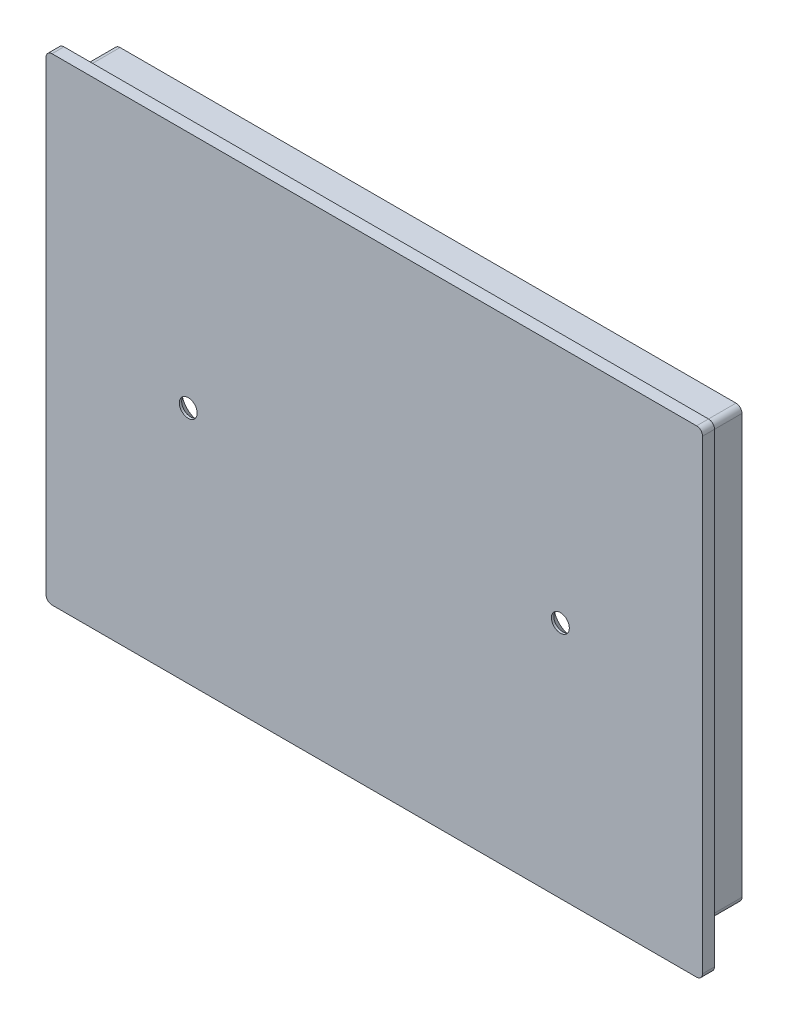
ISO-10303-21;
HEADER;
FILE_DESCRIPTION(('STEP AP214'),'2;1');
FILE_NAME('part.step','',(''),(''),'','','');
FILE_SCHEMA(('AUTOMOTIVE_DESIGN { 1 0 10303 214 1 1 1 1 }'));
ENDSEC;
DATA;
#1=APPLICATION_CONTEXT('core data for automotive mechanical design processes');
#2=APPLICATION_PROTOCOL_DEFINITION('international standard','automotive_design',2000,#1);
#3=PRODUCT_CONTEXT('',#1,'mechanical');
#4=PRODUCT('Part','Part','',(#3));
#5=PRODUCT_RELATED_PRODUCT_CATEGORY('part','',(#4));
#6=PRODUCT_DEFINITION_FORMATION('','',#4);
#7=PRODUCT_DEFINITION_CONTEXT('part definition',#1,'design');
#8=PRODUCT_DEFINITION('design','',#6,#7);
#9=PRODUCT_DEFINITION_SHAPE('','',#8);
#10=(LENGTH_UNIT() NAMED_UNIT(*) SI_UNIT(.MILLI.,.METRE.));
#11=(NAMED_UNIT(*) PLANE_ANGLE_UNIT() SI_UNIT($,.RADIAN.));
#12=(NAMED_UNIT(*) SI_UNIT($,.STERADIAN.) SOLID_ANGLE_UNIT());
#13=UNCERTAINTY_MEASURE_WITH_UNIT(LENGTH_MEASURE(1.E-05),#10,'distance_accuracy_value','');
#14=(GEOMETRIC_REPRESENTATION_CONTEXT(3) GLOBAL_UNCERTAINTY_ASSIGNED_CONTEXT((#13)) GLOBAL_UNIT_ASSIGNED_CONTEXT((#10,
#11,#12)) REPRESENTATION_CONTEXT('',''));
#15=CARTESIAN_POINT('',(0.,0.,0.));
#16=DIRECTION('',(0.,0.,1.));
#17=DIRECTION('',(1.,0.,0.));
#18=AXIS2_PLACEMENT_3D('',#15,#16,#17);
#19=CARTESIAN_POINT('',(0.,0.,81.));
#20=DIRECTION('',(0.,0.,1.));
#21=DIRECTION('',(1.,0.,0.));
#22=AXIS2_PLACEMENT_3D('',#19,#20,#21);
#23=PLANE('',#22);
#24=CARTESIAN_POINT('',(31.1737420602827,-1.51097315518228,81.));
#25=DIRECTION('',(0.,0.,1.));
#26=DIRECTION('',(1.,0.,0.));
#27=AXIS2_PLACEMENT_3D('',#24,#25,#26);
#28=CIRCLE('',#27,3.10000000000002);
#29=CARTESIAN_POINT('',(34.2737420602828,-1.51097315518228,81.));
#30=VERTEX_POINT('',#29);
#31=EDGE_CURVE('E399',#30,#30,#28,.T.);
#32=ORIENTED_EDGE('',*,*,#31,.T.);
#33=EDGE_LOOP('',(#32));
#34=FACE_BOUND('',#33,.T.);
#35=CARTESIAN_POINT('',(-31.1737420602827,-1.51097315518228,81.));
#36=DIRECTION('',(0.,0.,1.));
#37=DIRECTION('',(1.,0.,0.));
#38=AXIS2_PLACEMENT_3D('',#35,#36,#37);
#39=CIRCLE('',#38,3.10000000000002);
#40=CARTESIAN_POINT('',(-28.0737420602827,-1.51097315518228,81.));
#41=VERTEX_POINT('',#40);
#42=EDGE_CURVE('E386',#41,#41,#39,.T.);
#43=ORIENTED_EDGE('',*,*,#42,.T.);
#44=EDGE_LOOP('',(#43));
#45=FACE_BOUND('',#44,.T.);
#46=DIRECTION('',(-1.,0.,0.));
#47=VECTOR('',#46,1.);
#48=CARTESIAN_POINT('',(0.,-36.1109731551823,81.));
#49=LINE('',#48,#47);
#50=CARTESIAN_POINT('',(-51.,-36.1109731551823,81.));
#51=VERTEX_POINT('',#50);
#52=CARTESIAN_POINT('',(-51.6,-36.1109731551823,81.));
#53=VERTEX_POINT('',#52);
#54=EDGE_CURVE('E364',#51,#53,#49,.T.);
#55=ORIENTED_EDGE('',*,*,#54,.F.);
#56=CARTESIAN_POINT('',(-51.,-35.1109731551823,81.));
#57=DIRECTION('',(0.,0.,1.));
#58=DIRECTION('',(1.,0.,0.));
#59=AXIS2_PLACEMENT_3D('',#56,#57,#58);
#60=CIRCLE('',#59,1.);
#61=CARTESIAN_POINT('',(-50.,-35.1109731551823,81.));
#62=VERTEX_POINT('',#61);
#63=EDGE_CURVE('E488',#51,#62,#60,.T.);
#64=ORIENTED_EDGE('',*,*,#63,.T.);
#65=DIRECTION('',(0.,1.,0.));
#66=VECTOR('',#65,1.);
#67=CARTESIAN_POINT('',(-50.,0.,81.));
#68=LINE('',#67,#66);
#69=CARTESIAN_POINT('',(-50.,-34.1109731551823,81.));
#70=VERTEX_POINT('',#69);
#71=EDGE_CURVE('E318',#62,#70,#68,.T.);
#72=ORIENTED_EDGE('',*,*,#71,.T.);
#73=DIRECTION('',(-1.,0.,0.));
#74=VECTOR('',#73,1.);
#75=CARTESIAN_POINT('',(0.,-34.1109731551823,81.));
#76=LINE('',#75,#74);
#77=CARTESIAN_POINT('',(-50.6,-34.1109731551823,81.));
#78=VERTEX_POINT('',#77);
#79=EDGE_CURVE('E334',#70,#78,#76,.T.);
#80=ORIENTED_EDGE('',*,*,#79,.T.);
#81=DIRECTION('',(0.,1.,0.));
#82=VECTOR('',#81,1.);
#83=CARTESIAN_POINT('',(-50.6,0.,81.));
#84=LINE('',#83,#82);
#85=CARTESIAN_POINT('',(-50.6,34.0890268448177,81.));
#86=VERTEX_POINT('',#85);
#87=EDGE_CURVE('E337',#78,#86,#84,.T.);
#88=ORIENTED_EDGE('',*,*,#87,.T.);
#89=DIRECTION('',(1.,0.,0.));
#90=VECTOR('',#89,1.);
#91=CARTESIAN_POINT('',(0.,34.0890268448177,81.));
#92=LINE('',#91,#90);
#93=CARTESIAN_POINT('',(50.6,34.0890268448177,81.));
#94=VERTEX_POINT('',#93);
#95=EDGE_CURVE('E340',#86,#94,#92,.T.);
#96=ORIENTED_EDGE('',*,*,#95,.T.);
#97=DIRECTION('',(0.,-1.,0.));
#98=VECTOR('',#97,1.);
#99=CARTESIAN_POINT('',(50.6,0.,81.));
#100=LINE('',#99,#98);
#101=CARTESIAN_POINT('',(50.6,-34.1109731551823,81.));
#102=VERTEX_POINT('',#101);
#103=EDGE_CURVE('E343',#94,#102,#100,.T.);
#104=ORIENTED_EDGE('',*,*,#103,.T.);
#105=DIRECTION('',(-1.,0.,0.));
#106=VECTOR('',#105,1.);
#107=CARTESIAN_POINT('',(0.,-34.1109731551823,81.));
#108=LINE('',#107,#106);
#109=CARTESIAN_POINT('',(50.,-34.1109731551823,81.));
#110=VERTEX_POINT('',#109);
#111=EDGE_CURVE('E346',#102,#110,#108,.T.);
#112=ORIENTED_EDGE('',*,*,#111,.T.);
#113=DIRECTION('',(0.,-1.,0.));
#114=VECTOR('',#113,1.);
#115=CARTESIAN_POINT('',(50.,0.,81.));
#116=LINE('',#115,#114);
#117=CARTESIAN_POINT('',(50.,-35.1109731551823,81.));
#118=VERTEX_POINT('',#117);
#119=EDGE_CURVE('E349',#110,#118,#116,.T.);
#120=ORIENTED_EDGE('',*,*,#119,.T.);
#121=CARTESIAN_POINT('',(51.,-35.1109731551823,81.));
#122=DIRECTION('',(0.,0.,1.));
#123=DIRECTION('',(1.,0.,0.));
#124=AXIS2_PLACEMENT_3D('',#121,#122,#123);
#125=CIRCLE('',#124,1.);
#126=CARTESIAN_POINT('',(51.,-36.1109731551823,81.));
#127=VERTEX_POINT('',#126);
#128=EDGE_CURVE('E484',#118,#127,#125,.T.);
#129=ORIENTED_EDGE('',*,*,#128,.T.);
#130=DIRECTION('',(-1.,0.,0.));
#131=VECTOR('',#130,1.);
#132=CARTESIAN_POINT('',(0.,-36.1109731551823,81.));
#133=LINE('',#132,#131);
#134=CARTESIAN_POINT('',(51.6,-36.1109731551823,81.));
#135=VERTEX_POINT('',#134);
#136=EDGE_CURVE('E352',#135,#127,#133,.T.);
#137=ORIENTED_EDGE('',*,*,#136,.F.);
#138=CARTESIAN_POINT('',(51.6,-35.1109731551823,81.));
#139=DIRECTION('',(0.,0.,1.));
#140=DIRECTION('',(1.,0.,0.));
#141=AXIS2_PLACEMENT_3D('',#138,#139,#140);
#142=CIRCLE('',#141,1.);
#143=CARTESIAN_POINT('',(52.6,-35.1109731551823,81.));
#144=VERTEX_POINT('',#143);
#145=EDGE_CURVE('E486',#135,#144,#142,.T.);
#146=ORIENTED_EDGE('',*,*,#145,.T.);
#147=DIRECTION('',(0.,-1.,0.));
#148=VECTOR('',#147,1.);
#149=CARTESIAN_POINT('',(52.6,0.,81.));
#150=LINE('',#149,#148);
#151=CARTESIAN_POINT('',(52.6,35.0890268448177,81.));
#152=VERTEX_POINT('',#151);
#153=EDGE_CURVE('E355',#152,#144,#150,.T.);
#154=ORIENTED_EDGE('',*,*,#153,.F.);
#155=CARTESIAN_POINT('',(51.6,35.0890268448177,81.));
#156=DIRECTION('',(0.,0.,1.));
#157=DIRECTION('',(1.,0.,0.));
#158=AXIS2_PLACEMENT_3D('',#155,#156,#157);
#159=CIRCLE('',#158,1.);
#160=CARTESIAN_POINT('',(51.6,36.0890268448177,81.));
#161=VERTEX_POINT('',#160);
#162=EDGE_CURVE('E11',#152,#161,#159,.T.);
#163=ORIENTED_EDGE('',*,*,#162,.T.);
#164=DIRECTION('',(1.,0.,0.));
#165=VECTOR('',#164,1.);
#166=CARTESIAN_POINT('',(0.,36.0890268448177,81.));
#167=LINE('',#166,#165);
#168=CARTESIAN_POINT('',(-51.6,36.0890268448177,81.));
#169=VERTEX_POINT('',#168);
#170=EDGE_CURVE('E358',#169,#161,#167,.T.);
#171=ORIENTED_EDGE('',*,*,#170,.F.);
#172=CARTESIAN_POINT('',(-51.6,35.0890268448177,81.));
#173=DIRECTION('',(0.,0.,1.));
#174=DIRECTION('',(1.,0.,0.));
#175=AXIS2_PLACEMENT_3D('',#172,#173,#174);
#176=CIRCLE('',#175,1.);
#177=CARTESIAN_POINT('',(-52.6,35.0890268448177,81.));
#178=VERTEX_POINT('',#177);
#179=EDGE_CURVE('E46',#169,#178,#176,.T.);
#180=ORIENTED_EDGE('',*,*,#179,.T.);
#181=DIRECTION('',(0.,1.,0.));
#182=VECTOR('',#181,1.);
#183=CARTESIAN_POINT('',(-52.6,0.,81.));
#184=LINE('',#183,#182);
#185=CARTESIAN_POINT('',(-52.6,-35.1109731551823,81.));
#186=VERTEX_POINT('',#185);
#187=EDGE_CURVE('E361',#186,#178,#184,.T.);
#188=ORIENTED_EDGE('',*,*,#187,.F.);
#189=CARTESIAN_POINT('',(-51.6,-35.1109731551823,81.));
#190=DIRECTION('',(0.,0.,1.));
#191=DIRECTION('',(1.,0.,0.));
#192=AXIS2_PLACEMENT_3D('',#189,#190,#191);
#193=CIRCLE('',#192,1.);
#194=EDGE_CURVE('E490',#186,#53,#193,.T.);
#195=ORIENTED_EDGE('',*,*,#194,.T.);
#196=EDGE_LOOP('',(#55,#64,#72,#80,#88,#96,#104,#112,#120,#129,#137,#146,#154,#163,#171,#180,
#188,#195));
#197=FACE_BOUND('',#196,.T.);
#198=DIRECTION('',(1.,0.,0.));
#199=VECTOR('',#198,1.);
#200=CARTESIAN_POINT('',(-55.,-41.5109731551823,81.));
#201=LINE('',#200,#199);
#202=CARTESIAN_POINT('',(-54.,-41.5109731551823,81.));
#203=VERTEX_POINT('',#202);
#204=CARTESIAN_POINT('',(54.,-41.5109731551823,81.));
#205=VERTEX_POINT('',#204);
#206=EDGE_CURVE('E374',#203,#205,#201,.T.);
#207=ORIENTED_EDGE('',*,*,#206,.F.);
#208=CARTESIAN_POINT('',(-54.,-40.5109731551823,81.));
#209=DIRECTION('',(0.,0.,1.));
#210=DIRECTION('',(1.,0.,0.));
#211=AXIS2_PLACEMENT_3D('',#208,#209,#210);
#212=CIRCLE('',#211,1.);
#213=CARTESIAN_POINT('',(-55.,-40.5109731551823,81.));
#214=VERTEX_POINT('',#213);
#215=EDGE_CURVE('E473',#203,#214,#212,.F.);
#216=ORIENTED_EDGE('',*,*,#215,.T.);
#217=DIRECTION('',(0.,-1.,0.));
#218=VECTOR('',#217,1.);
#219=CARTESIAN_POINT('',(-55.,38.4890268448177,81.));
#220=LINE('',#219,#218);
#221=CARTESIAN_POINT('',(-55.,37.4890268448177,81.));
#222=VERTEX_POINT('',#221);
#223=EDGE_CURVE('E383',#222,#214,#220,.T.);
#224=ORIENTED_EDGE('',*,*,#223,.F.);
#225=CARTESIAN_POINT('',(-54.,37.4890268448177,81.));
#226=DIRECTION('',(0.,0.,1.));
#227=DIRECTION('',(1.,0.,0.));
#228=AXIS2_PLACEMENT_3D('',#225,#226,#227);
#229=CIRCLE('',#228,1.);
#230=CARTESIAN_POINT('',(-54.,38.4890268448177,81.));
#231=VERTEX_POINT('',#230);
#232=EDGE_CURVE('E468',#222,#231,#229,.F.);
#233=ORIENTED_EDGE('',*,*,#232,.T.);
#234=DIRECTION('',(-1.,0.,0.));
#235=VECTOR('',#234,1.);
#236=CARTESIAN_POINT('',(55.,38.4890268448177,81.));
#237=LINE('',#236,#235);
#238=CARTESIAN_POINT('',(54.,38.4890268448177,81.));
#239=VERTEX_POINT('',#238);
#240=EDGE_CURVE('E380',#239,#231,#237,.T.);
#241=ORIENTED_EDGE('',*,*,#240,.F.);
#242=CARTESIAN_POINT('',(54.,37.4890268448177,81.));
#243=DIRECTION('',(0.,0.,1.));
#244=DIRECTION('',(1.,0.,0.));
#245=AXIS2_PLACEMENT_3D('',#242,#243,#244);
#246=CIRCLE('',#245,1.);
#247=CARTESIAN_POINT('',(55.,37.4890268448177,81.));
#248=VERTEX_POINT('',#247);
#249=EDGE_CURVE('E53',#239,#248,#246,.F.);
#250=ORIENTED_EDGE('',*,*,#249,.T.);
#251=DIRECTION('',(0.,1.,0.));
#252=VECTOR('',#251,1.);
#253=CARTESIAN_POINT('',(55.,-41.5109731551823,81.));
#254=LINE('',#253,#252);
#255=CARTESIAN_POINT('',(55.,-40.5109731551823,81.));
#256=VERTEX_POINT('',#255);
#257=EDGE_CURVE('E377',#256,#248,#254,.T.);
#258=ORIENTED_EDGE('',*,*,#257,.F.);
#259=CARTESIAN_POINT('',(54.,-40.5109731551823,81.));
#260=DIRECTION('',(0.,0.,1.));
#261=DIRECTION('',(1.,0.,0.));
#262=AXIS2_PLACEMENT_3D('',#259,#260,#261);
#263=CIRCLE('',#262,1.);
#264=EDGE_CURVE('E471',#256,#205,#263,.F.);
#265=ORIENTED_EDGE('',*,*,#264,.T.);
#266=EDGE_LOOP('',(#207,#216,#224,#233,#241,#250,#258,#265));
#267=FACE_BOUND('',#266,.T.);
#268=DIRECTION('',(0.,1.,0.));
#269=VECTOR('',#268,1.);
#270=CARTESIAN_POINT('',(-49.6,0.,81.));
#271=LINE('',#270,#269);
#272=CARTESIAN_POINT('',(-49.6,-38.5109731551823,81.));
#273=VERTEX_POINT('',#272);
#274=CARTESIAN_POINT('',(-49.6,-36.5109731551823,81.));
#275=VERTEX_POINT('',#274);
#276=EDGE_CURVE('E277',#273,#275,#271,.T.);
#277=ORIENTED_EDGE('',*,*,#276,.F.);
#278=DIRECTION('',(1.,0.,0.));
#279=VECTOR('',#278,1.);
#280=CARTESIAN_POINT('',(0.,-38.5109731551823,81.));
#281=LINE('',#280,#279);
#282=CARTESIAN_POINT('',(49.6,-38.5109731551823,81.));
#283=VERTEX_POINT('',#282);
#284=EDGE_CURVE('E242',#273,#283,#281,.T.);
#285=ORIENTED_EDGE('',*,*,#284,.T.);
#286=DIRECTION('',(0.,-1.,0.));
#287=VECTOR('',#286,1.);
#288=CARTESIAN_POINT('',(49.6,0.,81.));
#289=LINE('',#288,#287);
#290=CARTESIAN_POINT('',(49.6,-36.5109731551823,81.));
#291=VERTEX_POINT('',#290);
#292=EDGE_CURVE('E271',#291,#283,#289,.T.);
#293=ORIENTED_EDGE('',*,*,#292,.F.);
#294=DIRECTION('',(-1.,0.,0.));
#295=VECTOR('',#294,1.);
#296=CARTESIAN_POINT('',(0.,-36.5109731551823,81.));
#297=LINE('',#296,#295);
#298=EDGE_CURVE('E274',#291,#275,#297,.T.);
#299=ORIENTED_EDGE('',*,*,#298,.T.);
#300=EDGE_LOOP('',(#277,#285,#293,#299));
#301=FACE_BOUND('',#300,.T.);
#302=ADVANCED_FACE('F38',(#34,#45,#197,#267,#301),#23,.F.);
#303=CARTESIAN_POINT('',(-55.,-41.5109731551823,81.));
#304=DIRECTION('',(0.,-1.,0.));
#305=DIRECTION('',(0.,0.,-1.));
#306=AXIS2_PLACEMENT_3D('',#303,#304,#305);
#307=PLANE('',#306);
#308=DIRECTION('',(1.,0.,0.));
#309=VECTOR('',#308,1.);
#310=CARTESIAN_POINT('',(-55.,-41.5109731551823,83.));
#311=LINE('',#310,#309);
#312=CARTESIAN_POINT('',(-54.,-41.5109731551823,83.));
#313=VERTEX_POINT('',#312);
#314=CARTESIAN_POINT('',(54.,-41.5109731551823,83.));
#315=VERTEX_POINT('',#314);
#316=EDGE_CURVE('E373',#313,#315,#311,.T.);
#317=ORIENTED_EDGE('',*,*,#316,.F.);
#318=DIRECTION('',(0.,0.,1.));
#319=VECTOR('',#318,1.);
#320=CARTESIAN_POINT('',(-54.,-41.5109731551823,81.));
#321=LINE('',#320,#319);
#322=EDGE_CURVE('E466',#313,#203,#321,.F.);
#323=ORIENTED_EDGE('',*,*,#322,.T.);
#324=ORIENTED_EDGE('',*,*,#206,.T.);
#325=DIRECTION('',(0.,0.,1.));
#326=VECTOR('',#325,1.);
#327=CARTESIAN_POINT('',(54.,-41.5109731551823,81.));
#328=LINE('',#327,#326);
#329=EDGE_CURVE('E463',#205,#315,#328,.T.);
#330=ORIENTED_EDGE('',*,*,#329,.T.);
#331=EDGE_LOOP('',(#317,#323,#324,#330));
#332=FACE_BOUND('',#331,.T.);
#333=ADVANCED_FACE('F577',(#332),#307,.T.);
#334=CARTESIAN_POINT('',(-55.,38.4890268448177,81.));
#335=DIRECTION('',(-1.,0.,0.));
#336=DIRECTION('',(0.,-1.,0.));
#337=AXIS2_PLACEMENT_3D('',#334,#335,#336);
#338=PLANE('',#337);
#339=ORIENTED_EDGE('',*,*,#223,.T.);
#340=DIRECTION('',(0.,0.,1.));
#341=VECTOR('',#340,1.);
#342=CARTESIAN_POINT('',(-55.,-40.5109731551823,81.));
#343=LINE('',#342,#341);
#344=CARTESIAN_POINT('',(-55.,-40.5109731551823,83.));
#345=VERTEX_POINT('',#344);
#346=EDGE_CURVE('E452',#214,#345,#343,.T.);
#347=ORIENTED_EDGE('',*,*,#346,.T.);
#348=DIRECTION('',(0.,-1.,0.));
#349=VECTOR('',#348,1.);
#350=CARTESIAN_POINT('',(-55.,38.4890268448177,83.));
#351=LINE('',#350,#349);
#352=CARTESIAN_POINT('',(-55.,37.4890268448177,83.));
#353=VERTEX_POINT('',#352);
#354=EDGE_CURVE('E378',#353,#345,#351,.T.);
#355=ORIENTED_EDGE('',*,*,#354,.F.);
#356=DIRECTION('',(0.,0.,1.));
#357=VECTOR('',#356,1.);
#358=CARTESIAN_POINT('',(-55.,37.4890268448177,81.));
#359=LINE('',#358,#357);
#360=EDGE_CURVE('E450',#353,#222,#359,.F.);
#361=ORIENTED_EDGE('',*,*,#360,.T.);
#362=EDGE_LOOP('',(#339,#347,#355,#361));
#363=FACE_BOUND('',#362,.T.);
#364=ADVANCED_FACE('F583',(#363),#338,.T.);
#365=CARTESIAN_POINT('',(55.,38.4890268448177,81.));
#366=DIRECTION('',(0.,1.,0.));
#367=DIRECTION('',(0.,0.,1.));
#368=AXIS2_PLACEMENT_3D('',#365,#366,#367);
#369=PLANE('',#368);
#370=DIRECTION('',(-1.,0.,0.));
#371=VECTOR('',#370,1.);
#372=CARTESIAN_POINT('',(55.,38.4890268448177,83.));
#373=LINE('',#372,#371);
#374=CARTESIAN_POINT('',(54.,38.4890268448177,83.));
#375=VERTEX_POINT('',#374);
#376=CARTESIAN_POINT('',(-54.,38.4890268448177,83.));
#377=VERTEX_POINT('',#376);
#378=EDGE_CURVE('E392',#375,#377,#373,.T.);
#379=ORIENTED_EDGE('',*,*,#378,.F.);
#380=DIRECTION('',(0.,0.,1.));
#381=VECTOR('',#380,1.);
#382=CARTESIAN_POINT('',(54.,38.4890268448177,81.));
#383=LINE('',#382,#381);
#384=EDGE_CURVE('E482',#375,#239,#383,.F.);
#385=ORIENTED_EDGE('',*,*,#384,.T.);
#386=ORIENTED_EDGE('',*,*,#240,.T.);
#387=DIRECTION('',(0.,0.,1.));
#388=VECTOR('',#387,1.);
#389=CARTESIAN_POINT('',(-54.,38.4890268448177,81.));
#390=LINE('',#389,#388);
#391=EDGE_CURVE('E479',#231,#377,#390,.T.);
#392=ORIENTED_EDGE('',*,*,#391,.T.);
#393=EDGE_LOOP('',(#379,#385,#386,#392));
#394=FACE_BOUND('',#393,.T.);
#395=ADVANCED_FACE('F598',(#394),#369,.T.);
#396=CARTESIAN_POINT('',(55.,-41.5109731551823,81.));
#397=DIRECTION('',(1.,0.,0.));
#398=DIRECTION('',(0.,1.,0.));
#399=AXIS2_PLACEMENT_3D('',#396,#397,#398);
#400=PLANE('',#399);
#401=DIRECTION('',(0.,1.,0.));
#402=VECTOR('',#401,1.);
#403=CARTESIAN_POINT('',(55.,-41.5109731551823,83.));
#404=LINE('',#403,#402);
#405=CARTESIAN_POINT('',(55.,-40.5109731551823,83.));
#406=VERTEX_POINT('',#405);
#407=CARTESIAN_POINT('',(55.,37.4890268448177,83.));
#408=VERTEX_POINT('',#407);
#409=EDGE_CURVE('E389',#406,#408,#404,.T.);
#410=ORIENTED_EDGE('',*,*,#409,.F.);
#411=DIRECTION('',(0.,0.,1.));
#412=VECTOR('',#411,1.);
#413=CARTESIAN_POINT('',(55.,-40.5109731551823,81.));
#414=LINE('',#413,#412);
#415=EDGE_CURVE('E60',#406,#256,#414,.F.);
#416=ORIENTED_EDGE('',*,*,#415,.T.);
#417=ORIENTED_EDGE('',*,*,#257,.T.);
#418=DIRECTION('',(0.,0.,1.));
#419=VECTOR('',#418,1.);
#420=CARTESIAN_POINT('',(55.,37.4890268448177,81.));
#421=LINE('',#420,#419);
#422=EDGE_CURVE('E475',#248,#408,#421,.T.);
#423=ORIENTED_EDGE('',*,*,#422,.T.);
#424=EDGE_LOOP('',(#410,#416,#417,#423));
#425=FACE_BOUND('',#424,.T.);
#426=ADVANCED_FACE('F594',(#425),#400,.T.);
#427=CARTESIAN_POINT('',(0.,0.,83.));
#428=DIRECTION('',(0.,0.,1.));
#429=DIRECTION('',(1.,0.,0.));
#430=AXIS2_PLACEMENT_3D('',#427,#428,#429);
#431=PLANE('',#430);
#432=CARTESIAN_POINT('',(31.1737420602827,-1.51097315518228,83.));
#433=DIRECTION('',(0.,0.,1.));
#434=DIRECTION('',(-1.,0.,0.));
#435=AXIS2_PLACEMENT_3D('',#432,#433,#434);
#436=CIRCLE('',#435,1.5);
#437=CARTESIAN_POINT('',(29.6737420602827,-1.51097315518228,83.));
#438=VERTEX_POINT('',#437);
#439=EDGE_CURVE('E367',#438,#438,#436,.T.);
#440=ORIENTED_EDGE('',*,*,#439,.F.);
#441=EDGE_LOOP('',(#440));
#442=FACE_BOUND('',#441,.T.);
#443=CARTESIAN_POINT('',(-31.1737420602827,-1.51097315518228,83.));
#444=DIRECTION('',(0.,0.,1.));
#445=DIRECTION('',(1.,0.,0.));
#446=AXIS2_PLACEMENT_3D('',#443,#444,#445);
#447=CIRCLE('',#446,1.5);
#448=CARTESIAN_POINT('',(-29.6737420602827,-1.51097315518228,83.));
#449=VERTEX_POINT('',#448);
#450=EDGE_CURVE('E370',#449,#449,#447,.T.);
#451=ORIENTED_EDGE('',*,*,#450,.F.);
#452=EDGE_LOOP('',(#451));
#453=FACE_BOUND('',#452,.T.);
#454=ORIENTED_EDGE('',*,*,#354,.T.);
#455=CARTESIAN_POINT('',(-54.,-40.5109731551823,83.));
#456=DIRECTION('',(0.,0.,1.));
#457=DIRECTION('',(1.,0.,0.));
#458=AXIS2_PLACEMENT_3D('',#455,#456,#457);
#459=CIRCLE('',#458,1.);
#460=EDGE_CURVE('E461',#345,#313,#459,.T.);
#461=ORIENTED_EDGE('',*,*,#460,.T.);
#462=ORIENTED_EDGE('',*,*,#316,.T.);
#463=CARTESIAN_POINT('',(54.,-40.5109731551823,83.));
#464=DIRECTION('',(0.,0.,1.));
#465=DIRECTION('',(1.,0.,0.));
#466=AXIS2_PLACEMENT_3D('',#463,#464,#465);
#467=CIRCLE('',#466,1.);
#468=EDGE_CURVE('E459',#315,#406,#467,.T.);
#469=ORIENTED_EDGE('',*,*,#468,.T.);
#470=ORIENTED_EDGE('',*,*,#409,.T.);
#471=CARTESIAN_POINT('',(54.,37.4890268448177,83.));
#472=DIRECTION('',(0.,0.,1.));
#473=DIRECTION('',(1.,0.,0.));
#474=AXIS2_PLACEMENT_3D('',#471,#472,#473);
#475=CIRCLE('',#474,1.);
#476=EDGE_CURVE('E457',#408,#375,#475,.T.);
#477=ORIENTED_EDGE('',*,*,#476,.T.);
#478=ORIENTED_EDGE('',*,*,#378,.T.);
#479=CARTESIAN_POINT('',(-54.,37.4890268448177,83.));
#480=DIRECTION('',(0.,0.,1.));
#481=DIRECTION('',(1.,0.,0.));
#482=AXIS2_PLACEMENT_3D('',#479,#480,#481);
#483=CIRCLE('',#482,1.);
#484=EDGE_CURVE('E455',#377,#353,#483,.T.);
#485=ORIENTED_EDGE('',*,*,#484,.T.);
#486=EDGE_LOOP('',(#454,#461,#462,#469,#470,#477,#478,#485));
#487=FACE_BOUND('',#486,.T.);
#488=ADVANCED_FACE('F591',(#442,#453,#487),#431,.T.);
#489=CARTESIAN_POINT('',(-31.1737420602827,-1.51097315518228,81.));
#490=DIRECTION('',(0.,0.,1.));
#491=DIRECTION('',(1.,0.,0.));
#492=AXIS2_PLACEMENT_3D('',#489,#490,#491);
#493=CYLINDRICAL_SURFACE('',#492,1.5);
#494=CARTESIAN_POINT('',(-31.1737420602827,-1.51097315518228,82.6));
#495=DIRECTION('',(0.,0.,1.));
#496=DIRECTION('',(1.,0.,0.));
#497=AXIS2_PLACEMENT_3D('',#494,#495,#496);
#498=CIRCLE('',#497,1.5);
#499=CARTESIAN_POINT('',(-29.6737420602827,-1.51097315518228,82.6));
#500=VERTEX_POINT('',#499);
#501=EDGE_CURVE('E405',#500,#500,#498,.F.);
#502=ORIENTED_EDGE('',*,*,#501,.T.);
#503=EDGE_LOOP('',(#502));
#504=FACE_BOUND('',#503,.T.);
#505=ORIENTED_EDGE('',*,*,#450,.T.);
#506=EDGE_LOOP('',(#505));
#507=FACE_BOUND('',#506,.T.);
#508=ADVANCED_FACE('F589',(#504,#507),#493,.F.);
#509=CARTESIAN_POINT('',(31.1737420602827,-1.51097315518228,81.));
#510=DIRECTION('',(0.,0.,1.));
#511=DIRECTION('',(1.,0.,0.));
#512=AXIS2_PLACEMENT_3D('',#509,#510,#511);
#513=CYLINDRICAL_SURFACE('',#512,1.5);
#514=CARTESIAN_POINT('',(31.1737420602827,-1.51097315518228,82.6));
#515=DIRECTION('',(0.,0.,1.));
#516=DIRECTION('',(1.,0.,0.));
#517=AXIS2_PLACEMENT_3D('',#514,#515,#516);
#518=CIRCLE('',#517,1.5);
#519=CARTESIAN_POINT('',(32.6737420602827,-1.51097315518228,82.6));
#520=VERTEX_POINT('',#519);
#521=EDGE_CURVE('E402',#520,#520,#518,.F.);
#522=ORIENTED_EDGE('',*,*,#521,.T.);
#523=EDGE_LOOP('',(#522));
#524=FACE_BOUND('',#523,.T.);
#525=ORIENTED_EDGE('',*,*,#439,.T.);
#526=EDGE_LOOP('',(#525));
#527=FACE_BOUND('',#526,.T.);
#528=ADVANCED_FACE('F807',(#524,#527),#513,.F.);
#529=CARTESIAN_POINT('',(0.,-36.1109731551823,74.));
#530=DIRECTION('',(0.,1.,0.));
#531=DIRECTION('',(0.,0.,1.));
#532=AXIS2_PLACEMENT_3D('',#529,#530,#531);
#533=PLANE('',#532);
#534=DIRECTION('',(-1.,0.,0.));
#535=VECTOR('',#534,1.);
#536=CARTESIAN_POINT('',(0.,-36.1109731551823,74.));
#537=LINE('',#536,#535);
#538=CARTESIAN_POINT('',(-51.,-36.1109731551823,74.));
#539=VERTEX_POINT('',#538);
#540=CARTESIAN_POINT('',(-51.6,-36.1109731551823,74.));
#541=VERTEX_POINT('',#540);
#542=EDGE_CURVE('E279',#539,#541,#537,.T.);
#543=ORIENTED_EDGE('',*,*,#542,.F.);
#544=DIRECTION('',(0.,0.,1.));
#545=VECTOR('',#544,1.);
#546=CARTESIAN_POINT('',(-51.,-36.1109731551823,81.));
#547=LINE('',#546,#545);
#548=EDGE_CURVE('E435',#539,#51,#547,.T.);
#549=ORIENTED_EDGE('',*,*,#548,.T.);
#550=ORIENTED_EDGE('',*,*,#54,.T.);
#551=DIRECTION('',(0.,0.,1.));
#552=VECTOR('',#551,1.);
#553=CARTESIAN_POINT('',(-51.6,-36.1109731551823,74.));
#554=LINE('',#553,#552);
#555=EDGE_CURVE('E433',#53,#541,#554,.F.);
#556=ORIENTED_EDGE('',*,*,#555,.T.);
#557=EDGE_LOOP('',(#543,#549,#550,#556));
#558=FACE_BOUND('',#557,.T.);
#559=ADVANCED_FACE('F563',(#558),#533,.F.);
#560=CARTESIAN_POINT('',(-52.6,0.,74.));
#561=DIRECTION('',(1.,0.,0.));
#562=DIRECTION('',(0.,0.,-1.));
#563=AXIS2_PLACEMENT_3D('',#560,#561,#562);
#564=PLANE('',#563);
#565=DIRECTION('',(0.,1.,0.));
#566=VECTOR('',#565,1.);
#567=CARTESIAN_POINT('',(-52.6,0.,74.));
#568=LINE('',#567,#566);
#569=CARTESIAN_POINT('',(-52.6,-35.1109731551823,74.));
#570=VERTEX_POINT('',#569);
#571=CARTESIAN_POINT('',(-52.6,35.0890268448177,74.));
#572=VERTEX_POINT('',#571);
#573=EDGE_CURVE('E311',#570,#572,#568,.T.);
#574=ORIENTED_EDGE('',*,*,#573,.F.);
#575=DIRECTION('',(0.,0.,1.));
#576=VECTOR('',#575,1.);
#577=CARTESIAN_POINT('',(-52.6,-35.1109731551823,74.));
#578=LINE('',#577,#576);
#579=EDGE_CURVE('E442',#570,#186,#578,.T.);
#580=ORIENTED_EDGE('',*,*,#579,.T.);
#581=ORIENTED_EDGE('',*,*,#187,.T.);
#582=DIRECTION('',(0.,0.,1.));
#583=VECTOR('',#582,1.);
#584=CARTESIAN_POINT('',(-52.6,35.0890268448177,74.));
#585=LINE('',#584,#583);
#586=EDGE_CURVE('E440',#178,#572,#585,.F.);
#587=ORIENTED_EDGE('',*,*,#586,.T.);
#588=EDGE_LOOP('',(#574,#580,#581,#587));
#589=FACE_BOUND('',#588,.T.);
#590=ADVANCED_FACE('F500',(#589),#564,.F.);
#591=CARTESIAN_POINT('',(0.,36.0890268448177,74.));
#592=DIRECTION('',(0.,-1.,0.));
#593=DIRECTION('',(0.,0.,-1.));
#594=AXIS2_PLACEMENT_3D('',#591,#592,#593);
#595=PLANE('',#594);
#596=DIRECTION('',(1.,0.,0.));
#597=VECTOR('',#596,1.);
#598=CARTESIAN_POINT('',(0.,36.0890268448177,74.));
#599=LINE('',#598,#597);
#600=CARTESIAN_POINT('',(-51.6,36.0890268448177,74.));
#601=VERTEX_POINT('',#600);
#602=CARTESIAN_POINT('',(51.6,36.0890268448177,74.));
#603=VERTEX_POINT('',#602);
#604=EDGE_CURVE('E308',#601,#603,#599,.T.);
#605=ORIENTED_EDGE('',*,*,#604,.F.);
#606=DIRECTION('',(0.,0.,1.));
#607=VECTOR('',#606,1.);
#608=CARTESIAN_POINT('',(-51.6,36.0890268448177,74.));
#609=LINE('',#608,#607);
#610=EDGE_CURVE('E447',#601,#169,#609,.T.);
#611=ORIENTED_EDGE('',*,*,#610,.T.);
#612=ORIENTED_EDGE('',*,*,#170,.T.);
#613=DIRECTION('',(0.,0.,1.));
#614=VECTOR('',#613,1.);
#615=CARTESIAN_POINT('',(51.6,36.0890268448177,74.));
#616=LINE('',#615,#614);
#617=EDGE_CURVE('E445',#161,#603,#616,.F.);
#618=ORIENTED_EDGE('',*,*,#617,.T.);
#619=EDGE_LOOP('',(#605,#611,#612,#618));
#620=FACE_BOUND('',#619,.T.);
#621=ADVANCED_FACE('F509',(#620),#595,.F.);
#622=CARTESIAN_POINT('',(52.6,0.,74.));
#623=DIRECTION('',(-1.,0.,0.));
#624=DIRECTION('',(0.,0.,1.));
#625=AXIS2_PLACEMENT_3D('',#622,#623,#624);
#626=PLANE('',#625);
#627=ORIENTED_EDGE('',*,*,#153,.T.);
#628=DIRECTION('',(0.,0.,1.));
#629=VECTOR('',#628,1.);
#630=CARTESIAN_POINT('',(52.6,-35.1109731551823,74.));
#631=LINE('',#630,#629);
#632=CARTESIAN_POINT('',(52.6,-35.1109731551823,74.));
#633=VERTEX_POINT('',#632);
#634=EDGE_CURVE('E431',#144,#633,#631,.F.);
#635=ORIENTED_EDGE('',*,*,#634,.T.);
#636=DIRECTION('',(0.,-1.,0.));
#637=VECTOR('',#636,1.);
#638=CARTESIAN_POINT('',(52.6,0.,74.));
#639=LINE('',#638,#637);
#640=CARTESIAN_POINT('',(52.6,35.0890268448177,74.));
#641=VERTEX_POINT('',#640);
#642=EDGE_CURVE('E305',#641,#633,#639,.T.);
#643=ORIENTED_EDGE('',*,*,#642,.F.);
#644=DIRECTION('',(0.,0.,1.));
#645=VECTOR('',#644,1.);
#646=CARTESIAN_POINT('',(52.6,35.0890268448177,74.));
#647=LINE('',#646,#645);
#648=EDGE_CURVE('E428',#641,#152,#647,.T.);
#649=ORIENTED_EDGE('',*,*,#648,.T.);
#650=EDGE_LOOP('',(#627,#635,#643,#649));
#651=FACE_BOUND('',#650,.T.);
#652=ADVANCED_FACE('F517',(#651),#626,.F.);
#653=CARTESIAN_POINT('',(0.,-36.1109731551823,74.));
#654=DIRECTION('',(0.,1.,0.));
#655=DIRECTION('',(0.,0.,1.));
#656=AXIS2_PLACEMENT_3D('',#653,#654,#655);
#657=PLANE('',#656);
#658=ORIENTED_EDGE('',*,*,#136,.T.);
#659=DIRECTION('',(0.,0.,1.));
#660=VECTOR('',#659,1.);
#661=CARTESIAN_POINT('',(51.,-36.1109731551823,74.));
#662=LINE('',#661,#660);
#663=CARTESIAN_POINT('',(51.,-36.1109731551823,74.));
#664=VERTEX_POINT('',#663);
#665=EDGE_CURVE('E414',#127,#664,#662,.F.);
#666=ORIENTED_EDGE('',*,*,#665,.T.);
#667=DIRECTION('',(-1.,0.,0.));
#668=VECTOR('',#667,1.);
#669=CARTESIAN_POINT('',(0.,-36.1109731551823,74.));
#670=LINE('',#669,#668);
#671=CARTESIAN_POINT('',(51.6,-36.1109731551823,74.));
#672=VERTEX_POINT('',#671);
#673=EDGE_CURVE('E302',#672,#664,#670,.T.);
#674=ORIENTED_EDGE('',*,*,#673,.F.);
#675=DIRECTION('',(0.,0.,1.));
#676=VECTOR('',#675,1.);
#677=CARTESIAN_POINT('',(51.6,-36.1109731551823,74.));
#678=LINE('',#677,#676);
#679=EDGE_CURVE('E411',#672,#135,#678,.T.);
#680=ORIENTED_EDGE('',*,*,#679,.T.);
#681=EDGE_LOOP('',(#658,#666,#674,#680));
#682=FACE_BOUND('',#681,.T.);
#683=ADVANCED_FACE('F526',(#682),#657,.F.);
#684=CARTESIAN_POINT('',(50.,0.,74.));
#685=DIRECTION('',(-1.,0.,0.));
#686=DIRECTION('',(0.,0.,1.));
#687=AXIS2_PLACEMENT_3D('',#684,#685,#686);
#688=PLANE('',#687);
#689=DIRECTION('',(0.,-1.,0.));
#690=VECTOR('',#689,1.);
#691=CARTESIAN_POINT('',(50.,0.,74.));
#692=LINE('',#691,#690);
#693=CARTESIAN_POINT('',(50.,-34.1109731551823,74.));
#694=VERTEX_POINT('',#693);
#695=CARTESIAN_POINT('',(50.,-35.1109731551823,74.));
#696=VERTEX_POINT('',#695);
#697=EDGE_CURVE('E299',#694,#696,#692,.T.);
#698=ORIENTED_EDGE('',*,*,#697,.T.);
#699=DIRECTION('',(0.,0.,1.));
#700=VECTOR('',#699,1.);
#701=CARTESIAN_POINT('',(50.,-35.1109731551823,81.));
#702=LINE('',#701,#700);
#703=EDGE_CURVE('E408',#696,#118,#702,.T.);
#704=ORIENTED_EDGE('',*,*,#703,.T.);
#705=ORIENTED_EDGE('',*,*,#119,.F.);
#706=DIRECTION('',(0.,0.,1.));
#707=VECTOR('',#706,1.);
#708=CARTESIAN_POINT('',(50.,-34.1109731551823,74.));
#709=LINE('',#708,#707);
#710=EDGE_CURVE('E315',#694,#110,#709,.T.);
#711=ORIENTED_EDGE('',*,*,#710,.F.);
#712=EDGE_LOOP('',(#698,#704,#705,#711));
#713=FACE_BOUND('',#712,.T.);
#714=ADVANCED_FACE('F535',(#713),#688,.T.);
#715=CARTESIAN_POINT('',(0.,-34.1109731551823,74.));
#716=DIRECTION('',(0.,1.,0.));
#717=DIRECTION('',(0.,0.,1.));
#718=AXIS2_PLACEMENT_3D('',#715,#716,#717);
#719=PLANE('',#718);
#720=ORIENTED_EDGE('',*,*,#111,.F.);
#721=DIRECTION('',(0.,0.,1.));
#722=VECTOR('',#721,1.);
#723=CARTESIAN_POINT('',(50.6,-34.1109731551823,74.));
#724=LINE('',#723,#722);
#725=CARTESIAN_POINT('',(50.6,-34.1109731551823,74.));
#726=VERTEX_POINT('',#725);
#727=EDGE_CURVE('E319',#726,#102,#724,.T.);
#728=ORIENTED_EDGE('',*,*,#727,.F.);
#729=DIRECTION('',(-1.,0.,0.));
#730=VECTOR('',#729,1.);
#731=CARTESIAN_POINT('',(0.,-34.1109731551823,74.));
#732=LINE('',#731,#730);
#733=EDGE_CURVE('E296',#726,#694,#732,.T.);
#734=ORIENTED_EDGE('',*,*,#733,.T.);
#735=ORIENTED_EDGE('',*,*,#710,.T.);
#736=EDGE_LOOP('',(#720,#728,#734,#735));
#737=FACE_BOUND('',#736,.T.);
#738=ADVANCED_FACE('F537',(#737),#719,.T.);
#739=CARTESIAN_POINT('',(50.6,0.,74.));
#740=DIRECTION('',(-1.,0.,0.));
#741=DIRECTION('',(0.,0.,1.));
#742=AXIS2_PLACEMENT_3D('',#739,#740,#741);
#743=PLANE('',#742);
#744=ORIENTED_EDGE('',*,*,#103,.F.);
#745=DIRECTION('',(0.,0.,1.));
#746=VECTOR('',#745,1.);
#747=CARTESIAN_POINT('',(50.6,34.0890268448177,74.));
#748=LINE('',#747,#746);
#749=CARTESIAN_POINT('',(50.6,34.0890268448177,74.));
#750=VERTEX_POINT('',#749);
#751=EDGE_CURVE('E322',#750,#94,#748,.T.);
#752=ORIENTED_EDGE('',*,*,#751,.F.);
#753=DIRECTION('',(0.,-1.,0.));
#754=VECTOR('',#753,1.);
#755=CARTESIAN_POINT('',(50.6,0.,74.));
#756=LINE('',#755,#754);
#757=EDGE_CURVE('E293',#750,#726,#756,.T.);
#758=ORIENTED_EDGE('',*,*,#757,.T.);
#759=ORIENTED_EDGE('',*,*,#727,.T.);
#760=EDGE_LOOP('',(#744,#752,#758,#759));
#761=FACE_BOUND('',#760,.T.);
#762=ADVANCED_FACE('F539',(#761),#743,.T.);
#763=CARTESIAN_POINT('',(0.,34.0890268448177,74.));
#764=DIRECTION('',(0.,-1.,0.));
#765=DIRECTION('',(0.,0.,-1.));
#766=AXIS2_PLACEMENT_3D('',#763,#764,#765);
#767=PLANE('',#766);
#768=ORIENTED_EDGE('',*,*,#95,.F.);
#769=DIRECTION('',(0.,0.,1.));
#770=VECTOR('',#769,1.);
#771=CARTESIAN_POINT('',(-50.6,34.0890268448177,74.));
#772=LINE('',#771,#770);
#773=CARTESIAN_POINT('',(-50.6,34.0890268448177,74.));
#774=VERTEX_POINT('',#773);
#775=EDGE_CURVE('E325',#774,#86,#772,.T.);
#776=ORIENTED_EDGE('',*,*,#775,.F.);
#777=DIRECTION('',(1.,0.,0.));
#778=VECTOR('',#777,1.);
#779=CARTESIAN_POINT('',(0.,34.0890268448177,74.));
#780=LINE('',#779,#778);
#781=EDGE_CURVE('E290',#774,#750,#780,.T.);
#782=ORIENTED_EDGE('',*,*,#781,.T.);
#783=ORIENTED_EDGE('',*,*,#751,.T.);
#784=EDGE_LOOP('',(#768,#776,#782,#783));
#785=FACE_BOUND('',#784,.T.);
#786=ADVANCED_FACE('F542',(#785),#767,.T.);
#787=CARTESIAN_POINT('',(-50.6,0.,74.));
#788=DIRECTION('',(1.,0.,0.));
#789=DIRECTION('',(0.,0.,-1.));
#790=AXIS2_PLACEMENT_3D('',#787,#788,#789);
#791=PLANE('',#790);
#792=ORIENTED_EDGE('',*,*,#87,.F.);
#793=DIRECTION('',(0.,0.,1.));
#794=VECTOR('',#793,1.);
#795=CARTESIAN_POINT('',(-50.6,-34.1109731551823,74.));
#796=LINE('',#795,#794);
#797=CARTESIAN_POINT('',(-50.6,-34.1109731551823,74.));
#798=VERTEX_POINT('',#797);
#799=EDGE_CURVE('E328',#798,#78,#796,.T.);
#800=ORIENTED_EDGE('',*,*,#799,.F.);
#801=DIRECTION('',(0.,1.,0.));
#802=VECTOR('',#801,1.);
#803=CARTESIAN_POINT('',(-50.6,0.,74.));
#804=LINE('',#803,#802);
#805=EDGE_CURVE('E287',#798,#774,#804,.T.);
#806=ORIENTED_EDGE('',*,*,#805,.T.);
#807=ORIENTED_EDGE('',*,*,#775,.T.);
#808=EDGE_LOOP('',(#792,#800,#806,#807));
#809=FACE_BOUND('',#808,.T.);
#810=ADVANCED_FACE('F547',(#809),#791,.T.);
#811=CARTESIAN_POINT('',(0.,-34.1109731551823,74.));
#812=DIRECTION('',(0.,1.,0.));
#813=DIRECTION('',(0.,0.,1.));
#814=AXIS2_PLACEMENT_3D('',#811,#812,#813);
#815=PLANE('',#814);
#816=ORIENTED_EDGE('',*,*,#79,.F.);
#817=DIRECTION('',(0.,0.,1.));
#818=VECTOR('',#817,1.);
#819=CARTESIAN_POINT('',(-50.,-34.1109731551823,74.));
#820=LINE('',#819,#818);
#821=CARTESIAN_POINT('',(-50.,-34.1109731551823,74.));
#822=VERTEX_POINT('',#821);
#823=EDGE_CURVE('E314',#822,#70,#820,.T.);
#824=ORIENTED_EDGE('',*,*,#823,.F.);
#825=DIRECTION('',(-1.,0.,0.));
#826=VECTOR('',#825,1.);
#827=CARTESIAN_POINT('',(0.,-34.1109731551823,74.));
#828=LINE('',#827,#826);
#829=EDGE_CURVE('E284',#822,#798,#828,.T.);
#830=ORIENTED_EDGE('',*,*,#829,.T.);
#831=ORIENTED_EDGE('',*,*,#799,.T.);
#832=EDGE_LOOP('',(#816,#824,#830,#831));
#833=FACE_BOUND('',#832,.T.);
#834=ADVANCED_FACE('F550',(#833),#815,.T.);
#835=CARTESIAN_POINT('',(-50.,0.,74.));
#836=DIRECTION('',(1.,0.,0.));
#837=DIRECTION('',(0.,0.,-1.));
#838=AXIS2_PLACEMENT_3D('',#835,#836,#837);
#839=PLANE('',#838);
#840=ORIENTED_EDGE('',*,*,#71,.F.);
#841=DIRECTION('',(0.,0.,1.));
#842=VECTOR('',#841,1.);
#843=CARTESIAN_POINT('',(-50.,-35.1109731551823,74.));
#844=LINE('',#843,#842);
#845=CARTESIAN_POINT('',(-50.,-35.1109731551823,74.));
#846=VERTEX_POINT('',#845);
#847=EDGE_CURVE('E438',#62,#846,#844,.F.);
#848=ORIENTED_EDGE('',*,*,#847,.T.);
#849=DIRECTION('',(0.,1.,0.));
#850=VECTOR('',#849,1.);
#851=CARTESIAN_POINT('',(-50.,0.,74.));
#852=LINE('',#851,#850);
#853=EDGE_CURVE('E282',#846,#822,#852,.T.);
#854=ORIENTED_EDGE('',*,*,#853,.T.);
#855=ORIENTED_EDGE('',*,*,#823,.T.);
#856=EDGE_LOOP('',(#840,#848,#854,#855));
#857=FACE_BOUND('',#856,.T.);
#858=ADVANCED_FACE('F555',(#857),#839,.T.);
#859=CARTESIAN_POINT('',(0.,0.,74.));
#860=DIRECTION('',(0.,0.,1.));
#861=DIRECTION('',(1.,0.,0.));
#862=AXIS2_PLACEMENT_3D('',#859,#860,#861);
#863=PLANE('',#862);
#864=ORIENTED_EDGE('',*,*,#673,.T.);
#865=CARTESIAN_POINT('',(51.,-35.1109731551823,74.));
#866=DIRECTION('',(0.,0.,1.));
#867=DIRECTION('',(1.,0.,0.));
#868=AXIS2_PLACEMENT_3D('',#865,#866,#867);
#869=CIRCLE('',#868,1.);
#870=EDGE_CURVE('E426',#664,#696,#869,.F.);
#871=ORIENTED_EDGE('',*,*,#870,.T.);
#872=ORIENTED_EDGE('',*,*,#697,.F.);
#873=ORIENTED_EDGE('',*,*,#733,.F.);
#874=ORIENTED_EDGE('',*,*,#757,.F.);
#875=ORIENTED_EDGE('',*,*,#781,.F.);
#876=ORIENTED_EDGE('',*,*,#805,.F.);
#877=ORIENTED_EDGE('',*,*,#829,.F.);
#878=ORIENTED_EDGE('',*,*,#853,.F.);
#879=CARTESIAN_POINT('',(-51.,-35.1109731551823,74.));
#880=DIRECTION('',(0.,0.,1.));
#881=DIRECTION('',(1.,0.,0.));
#882=AXIS2_PLACEMENT_3D('',#879,#880,#881);
#883=CIRCLE('',#882,1.);
#884=EDGE_CURVE('E422',#846,#539,#883,.F.);
#885=ORIENTED_EDGE('',*,*,#884,.T.);
#886=ORIENTED_EDGE('',*,*,#542,.T.);
#887=CARTESIAN_POINT('',(-51.6,-35.1109731551823,74.));
#888=DIRECTION('',(0.,0.,1.));
#889=DIRECTION('',(1.,0.,0.));
#890=AXIS2_PLACEMENT_3D('',#887,#888,#889);
#891=CIRCLE('',#890,1.);
#892=EDGE_CURVE('E420',#541,#570,#891,.F.);
#893=ORIENTED_EDGE('',*,*,#892,.T.);
#894=ORIENTED_EDGE('',*,*,#573,.T.);
#895=CARTESIAN_POINT('',(-51.6,35.0890268448177,74.));
#896=DIRECTION('',(0.,0.,1.));
#897=DIRECTION('',(1.,0.,0.));
#898=AXIS2_PLACEMENT_3D('',#895,#896,#897);
#899=CIRCLE('',#898,1.);
#900=EDGE_CURVE('E418',#572,#601,#899,.F.);
#901=ORIENTED_EDGE('',*,*,#900,.T.);
#902=ORIENTED_EDGE('',*,*,#604,.T.);
#903=CARTESIAN_POINT('',(51.6,35.0890268448177,74.));
#904=DIRECTION('',(0.,0.,1.));
#905=DIRECTION('',(1.,0.,0.));
#906=AXIS2_PLACEMENT_3D('',#903,#904,#905);
#907=CIRCLE('',#906,1.);
#908=EDGE_CURVE('E416',#603,#641,#907,.F.);
#909=ORIENTED_EDGE('',*,*,#908,.T.);
#910=ORIENTED_EDGE('',*,*,#642,.T.);
#911=CARTESIAN_POINT('',(51.6,-35.1109731551823,74.));
#912=DIRECTION('',(0.,0.,1.));
#913=DIRECTION('',(1.,0.,0.));
#914=AXIS2_PLACEMENT_3D('',#911,#912,#913);
#915=CIRCLE('',#914,1.);
#916=EDGE_CURVE('E424',#633,#672,#915,.F.);
#917=ORIENTED_EDGE('',*,*,#916,.T.);
#918=EDGE_LOOP('',(#864,#871,#872,#873,#874,#875,#876,#877,#878,#885,#886,#893,#894,#901,#902,
#909,#910,#917));
#919=FACE_BOUND('',#918,.T.);
#920=ADVANCED_FACE('F506',(#919),#863,.F.);
#921=CARTESIAN_POINT('',(-49.6,0.,78.));
#922=DIRECTION('',(1.,0.,0.));
#923=DIRECTION('',(0.,0.,-1.));
#924=AXIS2_PLACEMENT_3D('',#921,#922,#923);
#925=PLANE('',#924);
#926=DIRECTION('',(0.,0.,1.));
#927=VECTOR('',#926,1.);
#928=CARTESIAN_POINT('',(-49.6,-38.5109731551823,78.));
#929=LINE('',#928,#927);
#930=CARTESIAN_POINT('',(-49.6,-38.5109731551823,78.));
#931=VERTEX_POINT('',#930);
#932=EDGE_CURVE('E236',#931,#273,#929,.T.);
#933=ORIENTED_EDGE('',*,*,#932,.T.);
#934=ORIENTED_EDGE('',*,*,#276,.T.);
#935=DIRECTION('',(0.,0.,1.));
#936=VECTOR('',#935,1.);
#937=CARTESIAN_POINT('',(-49.6,-36.5109731551823,78.));
#938=LINE('',#937,#936);
#939=CARTESIAN_POINT('',(-49.6,-36.5109731551823,78.));
#940=VERTEX_POINT('',#939);
#941=EDGE_CURVE('E252',#940,#275,#938,.T.);
#942=ORIENTED_EDGE('',*,*,#941,.F.);
#943=DIRECTION('',(0.,1.,0.));
#944=VECTOR('',#943,1.);
#945=CARTESIAN_POINT('',(-49.6,0.,78.));
#946=LINE('',#945,#944);
#947=EDGE_CURVE('E249',#931,#940,#946,.T.);
#948=ORIENTED_EDGE('',*,*,#947,.F.);
#949=EDGE_LOOP('',(#933,#934,#942,#948));
#950=FACE_BOUND('',#949,.T.);
#951=ADVANCED_FACE('F250',(#950),#925,.F.);
#952=CARTESIAN_POINT('',(0.,-36.5109731551823,78.));
#953=DIRECTION('',(0.,1.,0.));
#954=DIRECTION('',(-1.,0.,0.));
#955=AXIS2_PLACEMENT_3D('',#952,#953,#954);
#956=PLANE('',#955);
#957=ORIENTED_EDGE('',*,*,#298,.F.);
#958=DIRECTION('',(0.,0.,1.));
#959=VECTOR('',#958,1.);
#960=CARTESIAN_POINT('',(49.6,-36.5109731551823,78.));
#961=LINE('',#960,#959);
#962=CARTESIAN_POINT('',(49.6,-36.5109731551823,78.));
#963=VERTEX_POINT('',#962);
#964=EDGE_CURVE('E266',#963,#291,#961,.T.);
#965=ORIENTED_EDGE('',*,*,#964,.F.);
#966=DIRECTION('',(-1.,0.,0.));
#967=VECTOR('',#966,1.);
#968=CARTESIAN_POINT('',(0.,-36.5109731551823,78.));
#969=LINE('',#968,#967);
#970=EDGE_CURVE('E246',#963,#940,#969,.T.);
#971=ORIENTED_EDGE('',*,*,#970,.T.);
#972=ORIENTED_EDGE('',*,*,#941,.T.);
#973=EDGE_LOOP('',(#957,#965,#971,#972));
#974=FACE_BOUND('',#973,.T.);
#975=ADVANCED_FACE('F691',(#974),#956,.T.);
#976=CARTESIAN_POINT('',(49.6,0.,78.));
#977=DIRECTION('',(-1.,0.,0.));
#978=DIRECTION('',(0.,0.,1.));
#979=AXIS2_PLACEMENT_3D('',#976,#977,#978);
#980=PLANE('',#979);
#981=ORIENTED_EDGE('',*,*,#964,.T.);
#982=ORIENTED_EDGE('',*,*,#292,.T.);
#983=DIRECTION('',(0.,0.,1.));
#984=VECTOR('',#983,1.);
#985=CARTESIAN_POINT('',(49.6,-38.5109731551823,78.));
#986=LINE('',#985,#984);
#987=CARTESIAN_POINT('',(49.6,-38.5109731551823,78.));
#988=VERTEX_POINT('',#987);
#989=EDGE_CURVE('E245',#988,#283,#986,.T.);
#990=ORIENTED_EDGE('',*,*,#989,.F.);
#991=DIRECTION('',(0.,-1.,0.));
#992=VECTOR('',#991,1.);
#993=CARTESIAN_POINT('',(49.6,0.,78.));
#994=LINE('',#993,#992);
#995=EDGE_CURVE('E259',#963,#988,#994,.T.);
#996=ORIENTED_EDGE('',*,*,#995,.F.);
#997=EDGE_LOOP('',(#981,#982,#990,#996));
#998=FACE_BOUND('',#997,.T.);
#999=ADVANCED_FACE('F686',(#998),#980,.F.);
#1000=CARTESIAN_POINT('',(0.,-38.5109731551823,78.));
#1001=DIRECTION('',(0.,-1.,0.));
#1002=DIRECTION('',(0.,0.,-1.));
#1003=AXIS2_PLACEMENT_3D('',#1000,#1001,#1002);
#1004=PLANE('',#1003);
#1005=ORIENTED_EDGE('',*,*,#284,.F.);
#1006=ORIENTED_EDGE('',*,*,#932,.F.);
#1007=DIRECTION('',(1.,0.,0.));
#1008=VECTOR('',#1007,1.);
#1009=CARTESIAN_POINT('',(0.,-38.5109731551823,78.));
#1010=LINE('',#1009,#1008);
#1011=EDGE_CURVE('E240',#931,#988,#1010,.T.);
#1012=ORIENTED_EDGE('',*,*,#1011,.T.);
#1013=ORIENTED_EDGE('',*,*,#989,.T.);
#1014=EDGE_LOOP('',(#1005,#1006,#1012,#1013));
#1015=FACE_BOUND('',#1014,.T.);
#1016=ADVANCED_FACE('F238',(#1015),#1004,.T.);
#1017=CARTESIAN_POINT('',(0.,0.,78.));
#1018=DIRECTION('',(0.,0.,1.));
#1019=DIRECTION('',(1.,0.,0.));
#1020=AXIS2_PLACEMENT_3D('',#1017,#1018,#1019);
#1021=PLANE('',#1020);
#1022=ORIENTED_EDGE('',*,*,#947,.T.);
#1023=ORIENTED_EDGE('',*,*,#970,.F.);
#1024=ORIENTED_EDGE('',*,*,#995,.T.);
#1025=ORIENTED_EDGE('',*,*,#1011,.F.);
#1026=EDGE_LOOP('',(#1022,#1023,#1024,#1025));
#1027=FACE_BOUND('',#1026,.T.);
#1028=ADVANCED_FACE('F257',(#1027),#1021,.F.);
#1029=CARTESIAN_POINT('',(31.1737420602827,-1.51097315518228,81.));
#1030=DIRECTION('',(0.,0.,-1.));
#1031=DIRECTION('',(-1.,0.,0.));
#1032=AXIS2_PLACEMENT_3D('',#1029,#1030,#1031);
#1033=CONICAL_SURFACE('',#1032,3.10000000000002,0.785398163397453);
#1034=ORIENTED_EDGE('',*,*,#521,.F.);
#1035=EDGE_LOOP('',(#1034));
#1036=FACE_BOUND('',#1035,.T.);
#1037=ORIENTED_EDGE('',*,*,#31,.F.);
#1038=EDGE_LOOP('',(#1037));
#1039=FACE_BOUND('',#1038,.T.);
#1040=ADVANCED_FACE('F605',(#1036,#1039),#1033,.F.);
#1041=CARTESIAN_POINT('',(-31.1737420602827,-1.51097315518228,81.));
#1042=DIRECTION('',(0.,0.,-1.));
#1043=DIRECTION('',(-1.,0.,0.));
#1044=AXIS2_PLACEMENT_3D('',#1041,#1042,#1043);
#1045=CONICAL_SURFACE('',#1044,3.10000000000002,0.785398163397453);
#1046=ORIENTED_EDGE('',*,*,#501,.F.);
#1047=EDGE_LOOP('',(#1046));
#1048=FACE_BOUND('',#1047,.T.);
#1049=ORIENTED_EDGE('',*,*,#42,.F.);
#1050=EDGE_LOOP('',(#1049));
#1051=FACE_BOUND('',#1050,.T.);
#1052=ADVANCED_FACE('F608',(#1048,#1051),#1045,.F.);
#1053=CARTESIAN_POINT('',(51.,-35.1109731551823,74.));
#1054=DIRECTION('',(0.,0.,-1.));
#1055=DIRECTION('',(-1.,0.,0.));
#1056=AXIS2_PLACEMENT_3D('',#1053,#1054,#1055);
#1057=CYLINDRICAL_SURFACE('',#1056,1.);
#1058=ORIENTED_EDGE('',*,*,#870,.F.);
#1059=ORIENTED_EDGE('',*,*,#665,.F.);
#1060=ORIENTED_EDGE('',*,*,#128,.F.);
#1061=ORIENTED_EDGE('',*,*,#703,.F.);
#1062=EDGE_LOOP('',(#1058,#1059,#1060,#1061));
#1063=FACE_BOUND('',#1062,.T.);
#1064=ADVANCED_FACE('F530',(#1063),#1057,.T.);
#1065=CARTESIAN_POINT('',(51.6,-35.1109731551823,74.));
#1066=DIRECTION('',(0.,0.,1.));
#1067=DIRECTION('',(1.,0.,0.));
#1068=AXIS2_PLACEMENT_3D('',#1065,#1066,#1067);
#1069=CYLINDRICAL_SURFACE('',#1068,1.);
#1070=ORIENTED_EDGE('',*,*,#916,.F.);
#1071=ORIENTED_EDGE('',*,*,#634,.F.);
#1072=ORIENTED_EDGE('',*,*,#145,.F.);
#1073=ORIENTED_EDGE('',*,*,#679,.F.);
#1074=EDGE_LOOP('',(#1070,#1071,#1072,#1073));
#1075=FACE_BOUND('',#1074,.T.);
#1076=ADVANCED_FACE('F521',(#1075),#1069,.T.);
#1077=CARTESIAN_POINT('',(-51.,-35.1109731551823,74.));
#1078=DIRECTION('',(0.,0.,-1.));
#1079=DIRECTION('',(-1.,0.,0.));
#1080=AXIS2_PLACEMENT_3D('',#1077,#1078,#1079);
#1081=CYLINDRICAL_SURFACE('',#1080,1.);
#1082=ORIENTED_EDGE('',*,*,#884,.F.);
#1083=ORIENTED_EDGE('',*,*,#847,.F.);
#1084=ORIENTED_EDGE('',*,*,#63,.F.);
#1085=ORIENTED_EDGE('',*,*,#548,.F.);
#1086=EDGE_LOOP('',(#1082,#1083,#1084,#1085));
#1087=FACE_BOUND('',#1086,.T.);
#1088=ADVANCED_FACE('F561',(#1087),#1081,.T.);
#1089=CARTESIAN_POINT('',(-51.6,-35.1109731551823,74.));
#1090=DIRECTION('',(0.,0.,1.));
#1091=DIRECTION('',(1.,0.,0.));
#1092=AXIS2_PLACEMENT_3D('',#1089,#1090,#1091);
#1093=CYLINDRICAL_SURFACE('',#1092,1.);
#1094=ORIENTED_EDGE('',*,*,#892,.F.);
#1095=ORIENTED_EDGE('',*,*,#555,.F.);
#1096=ORIENTED_EDGE('',*,*,#194,.F.);
#1097=ORIENTED_EDGE('',*,*,#579,.F.);
#1098=EDGE_LOOP('',(#1094,#1095,#1096,#1097));
#1099=FACE_BOUND('',#1098,.T.);
#1100=ADVANCED_FACE('F567',(#1099),#1093,.T.);
#1101=CARTESIAN_POINT('',(-51.6,35.0890268448177,74.));
#1102=DIRECTION('',(0.,0.,1.));
#1103=DIRECTION('',(1.,0.,0.));
#1104=AXIS2_PLACEMENT_3D('',#1101,#1102,#1103);
#1105=CYLINDRICAL_SURFACE('',#1104,1.);
#1106=ORIENTED_EDGE('',*,*,#900,.F.);
#1107=ORIENTED_EDGE('',*,*,#586,.F.);
#1108=ORIENTED_EDGE('',*,*,#179,.F.);
#1109=ORIENTED_EDGE('',*,*,#610,.F.);
#1110=EDGE_LOOP('',(#1106,#1107,#1108,#1109));
#1111=FACE_BOUND('',#1110,.T.);
#1112=ADVANCED_FACE('F503',(#1111),#1105,.T.);
#1113=CARTESIAN_POINT('',(51.6,35.0890268448177,74.));
#1114=DIRECTION('',(0.,0.,1.));
#1115=DIRECTION('',(1.,0.,0.));
#1116=AXIS2_PLACEMENT_3D('',#1113,#1114,#1115);
#1117=CYLINDRICAL_SURFACE('',#1116,1.);
#1118=ORIENTED_EDGE('',*,*,#908,.F.);
#1119=ORIENTED_EDGE('',*,*,#617,.F.);
#1120=ORIENTED_EDGE('',*,*,#162,.F.);
#1121=ORIENTED_EDGE('',*,*,#648,.F.);
#1122=EDGE_LOOP('',(#1118,#1119,#1120,#1121));
#1123=FACE_BOUND('',#1122,.T.);
#1124=ADVANCED_FACE('F512',(#1123),#1117,.T.);
#1125=CARTESIAN_POINT('',(-54.,-40.5109731551823,81.));
#1126=DIRECTION('',(0.,0.,1.));
#1127=DIRECTION('',(1.,0.,0.));
#1128=AXIS2_PLACEMENT_3D('',#1125,#1126,#1127);
#1129=CYLINDRICAL_SURFACE('',#1128,1.);
#1130=ORIENTED_EDGE('',*,*,#215,.F.);
#1131=ORIENTED_EDGE('',*,*,#322,.F.);
#1132=ORIENTED_EDGE('',*,*,#460,.F.);
#1133=ORIENTED_EDGE('',*,*,#346,.F.);
#1134=EDGE_LOOP('',(#1130,#1131,#1132,#1133));
#1135=FACE_BOUND('',#1134,.T.);
#1136=ADVANCED_FACE('F646',(#1135),#1129,.T.);
#1137=CARTESIAN_POINT('',(54.,-40.5109731551823,81.));
#1138=DIRECTION('',(0.,0.,1.));
#1139=DIRECTION('',(1.,0.,0.));
#1140=AXIS2_PLACEMENT_3D('',#1137,#1138,#1139);
#1141=CYLINDRICAL_SURFACE('',#1140,1.);
#1142=ORIENTED_EDGE('',*,*,#264,.F.);
#1143=ORIENTED_EDGE('',*,*,#415,.F.);
#1144=ORIENTED_EDGE('',*,*,#468,.F.);
#1145=ORIENTED_EDGE('',*,*,#329,.F.);
#1146=EDGE_LOOP('',(#1142,#1143,#1144,#1145));
#1147=FACE_BOUND('',#1146,.T.);
#1148=ADVANCED_FACE('F655',(#1147),#1141,.T.);
#1149=CARTESIAN_POINT('',(54.,37.4890268448177,81.));
#1150=DIRECTION('',(0.,0.,1.));
#1151=DIRECTION('',(1.,0.,0.));
#1152=AXIS2_PLACEMENT_3D('',#1149,#1150,#1151);
#1153=CYLINDRICAL_SURFACE('',#1152,1.);
#1154=ORIENTED_EDGE('',*,*,#249,.F.);
#1155=ORIENTED_EDGE('',*,*,#384,.F.);
#1156=ORIENTED_EDGE('',*,*,#476,.F.);
#1157=ORIENTED_EDGE('',*,*,#422,.F.);
#1158=EDGE_LOOP('',(#1154,#1155,#1156,#1157));
#1159=FACE_BOUND('',#1158,.T.);
#1160=ADVANCED_FACE('F665',(#1159),#1153,.T.);
#1161=CARTESIAN_POINT('',(-54.,37.4890268448177,81.));
#1162=DIRECTION('',(0.,0.,1.));
#1163=DIRECTION('',(1.,0.,0.));
#1164=AXIS2_PLACEMENT_3D('',#1161,#1162,#1163);
#1165=CYLINDRICAL_SURFACE('',#1164,1.);
#1166=ORIENTED_EDGE('',*,*,#232,.F.);
#1167=ORIENTED_EDGE('',*,*,#360,.F.);
#1168=ORIENTED_EDGE('',*,*,#484,.F.);
#1169=ORIENTED_EDGE('',*,*,#391,.F.);
#1170=EDGE_LOOP('',(#1166,#1167,#1168,#1169));
#1171=FACE_BOUND('',#1170,.T.);
#1172=ADVANCED_FACE('F40',(#1171),#1165,.T.);
#1173=CLOSED_SHELL('',(#302,#333,#364,#395,#426,#488,#508,#528,#559,#590,#621,#652,#683,#714,
#738,#762,#786,#810,#834,#858,#920,#951,#975,#999,#1016,#1028,#1040,#1052,#1064,#1076,#1088,
#1100,#1112,#1124,#1136,#1148,#1160,#1172));
#1174=MANIFOLD_SOLID_BREP('B2',#1173);
#1175=ADVANCED_BREP_SHAPE_REPRESENTATION('',(#18,#1174),#14);
#1176=SHAPE_DEFINITION_REPRESENTATION(#9,#1175);
ENDSEC;
END-ISO-10303-21;
